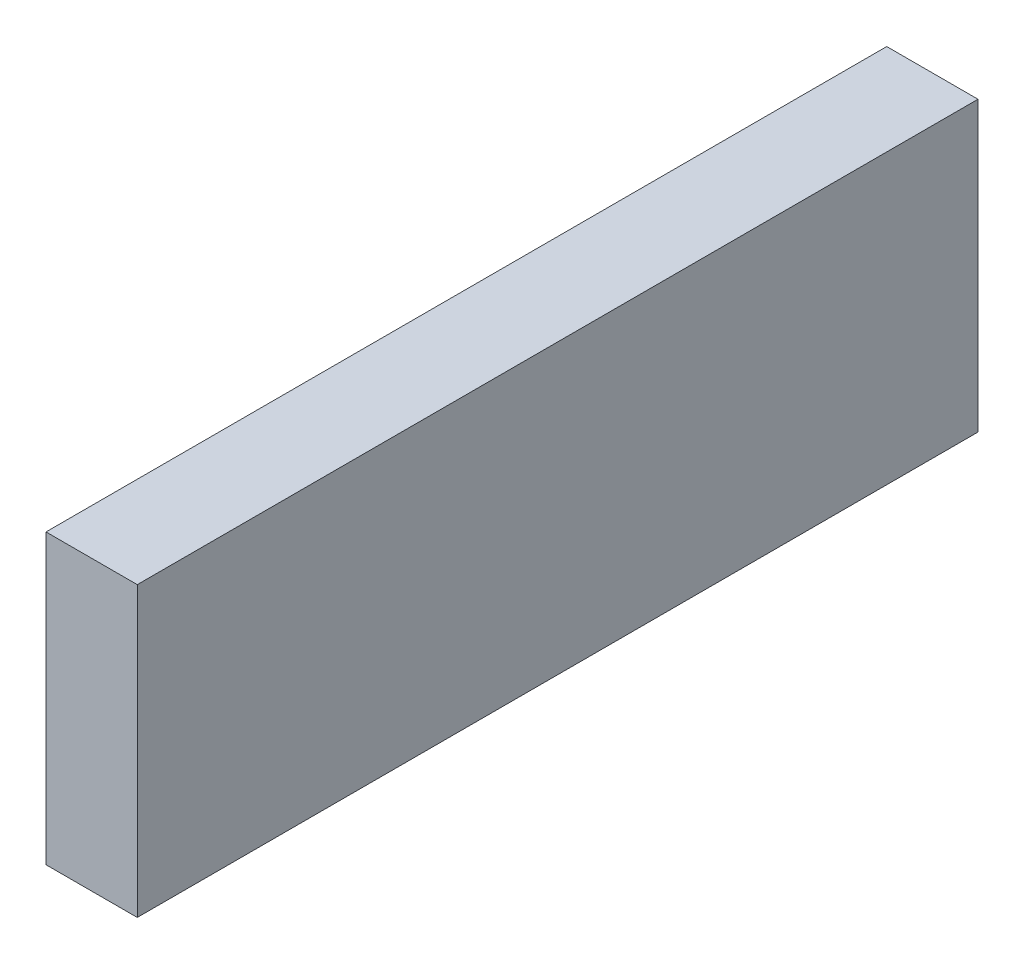
ISO-10303-21;
HEADER;
FILE_DESCRIPTION(('STEP AP214'),'2;1');
FILE_NAME('part.step','',(''),(''),'','','');
FILE_SCHEMA(('AUTOMOTIVE_DESIGN { 1 0 10303 214 1 1 1 1 }'));
ENDSEC;
DATA;
#1=APPLICATION_CONTEXT('core data for automotive mechanical design processes');
#2=APPLICATION_PROTOCOL_DEFINITION('international standard','automotive_design',2000,#1);
#3=PRODUCT_CONTEXT('',#1,'mechanical');
#4=PRODUCT('Part','Part','',(#3));
#5=PRODUCT_RELATED_PRODUCT_CATEGORY('part','',(#4));
#6=PRODUCT_DEFINITION_FORMATION('','',#4);
#7=PRODUCT_DEFINITION_CONTEXT('part definition',#1,'design');
#8=PRODUCT_DEFINITION('design','',#6,#7);
#9=PRODUCT_DEFINITION_SHAPE('','',#8);
#10=(LENGTH_UNIT() NAMED_UNIT(*) SI_UNIT(.MILLI.,.METRE.));
#11=(NAMED_UNIT(*) PLANE_ANGLE_UNIT() SI_UNIT($,.RADIAN.));
#12=(NAMED_UNIT(*) SI_UNIT($,.STERADIAN.) SOLID_ANGLE_UNIT());
#13=UNCERTAINTY_MEASURE_WITH_UNIT(LENGTH_MEASURE(1.E-05),#10,'distance_accuracy_value','');
#14=(GEOMETRIC_REPRESENTATION_CONTEXT(3) GLOBAL_UNCERTAINTY_ASSIGNED_CONTEXT((#13)) GLOBAL_UNIT_ASSIGNED_CONTEXT((#10,
#11,#12)) REPRESENTATION_CONTEXT('',''));
#15=CARTESIAN_POINT('',(0.,0.,0.));
#16=DIRECTION('',(0.,0.,1.));
#17=DIRECTION('',(1.,0.,0.));
#18=AXIS2_PLACEMENT_3D('',#15,#16,#17);
#19=CARTESIAN_POINT('',(19.,-30.,87.5));
#20=DIRECTION('',(0.,0.,-1.));
#21=DIRECTION('',(-1.,0.,0.));
#22=AXIS2_PLACEMENT_3D('',#19,#20,#21);
#23=PLANE('',#22);
#24=DIRECTION('',(0.,-1.,0.));
#25=VECTOR('',#24,1.);
#26=CARTESIAN_POINT('',(0.,-30.,87.5));
#27=LINE('',#26,#25);
#28=CARTESIAN_POINT('',(0.,30.,87.5));
#29=VERTEX_POINT('',#28);
#30=CARTESIAN_POINT('',(0.,-30.,87.5));
#31=VERTEX_POINT('',#30);
#32=EDGE_CURVE('E96',#29,#31,#27,.T.);
#33=ORIENTED_EDGE('',*,*,#32,.T.);
#34=DIRECTION('',(-1.,0.,0.));
#35=VECTOR('',#34,1.);
#36=CARTESIAN_POINT('',(19.,-30.,87.5));
#37=LINE('',#36,#35);
#38=CARTESIAN_POINT('',(19.,-30.,87.5));
#39=VERTEX_POINT('',#38);
#40=EDGE_CURVE('E11',#39,#31,#37,.T.);
#41=ORIENTED_EDGE('',*,*,#40,.F.);
#42=DIRECTION('',(0.,-1.,0.));
#43=VECTOR('',#42,1.);
#44=CARTESIAN_POINT('',(19.,-30.,87.5));
#45=LINE('',#44,#43);
#46=CARTESIAN_POINT('',(19.,30.,87.5));
#47=VERTEX_POINT('',#46);
#48=EDGE_CURVE('E84',#47,#39,#45,.T.);
#49=ORIENTED_EDGE('',*,*,#48,.F.);
#50=DIRECTION('',(-1.,0.,0.));
#51=VECTOR('',#50,1.);
#52=CARTESIAN_POINT('',(19.,30.,87.5));
#53=LINE('',#52,#51);
#54=EDGE_CURVE('E92',#47,#29,#53,.T.);
#55=ORIENTED_EDGE('',*,*,#54,.T.);
#56=EDGE_LOOP('',(#33,#41,#49,#55));
#57=FACE_BOUND('',#56,.T.);
#58=ADVANCED_FACE('F33',(#57),#23,.F.);
#59=CARTESIAN_POINT('',(19.,-30.,87.5));
#60=DIRECTION('',(0.,1.,0.));
#61=DIRECTION('',(0.,0.,1.));
#62=AXIS2_PLACEMENT_3D('',#59,#60,#61);
#63=PLANE('',#62);
#64=DIRECTION('',(0.,0.,-1.));
#65=VECTOR('',#64,1.);
#66=CARTESIAN_POINT('',(0.,-30.,87.5));
#67=LINE('',#66,#65);
#68=CARTESIAN_POINT('',(0.,-30.,-87.5));
#69=VERTEX_POINT('',#68);
#70=EDGE_CURVE('E88',#31,#69,#67,.T.);
#71=ORIENTED_EDGE('',*,*,#70,.T.);
#72=DIRECTION('',(-1.,0.,0.));
#73=VECTOR('',#72,1.);
#74=CARTESIAN_POINT('',(19.,-30.,-87.5));
#75=LINE('',#74,#73);
#76=CARTESIAN_POINT('',(19.,-30.,-87.5));
#77=VERTEX_POINT('',#76);
#78=EDGE_CURVE('E41',#77,#69,#75,.T.);
#79=ORIENTED_EDGE('',*,*,#78,.F.);
#80=DIRECTION('',(0.,0.,-1.));
#81=VECTOR('',#80,1.);
#82=CARTESIAN_POINT('',(19.,-30.,87.5));
#83=LINE('',#82,#81);
#84=EDGE_CURVE('E79',#39,#77,#83,.T.);
#85=ORIENTED_EDGE('',*,*,#84,.F.);
#86=ORIENTED_EDGE('',*,*,#40,.T.);
#87=EDGE_LOOP('',(#71,#79,#85,#86));
#88=FACE_BOUND('',#87,.T.);
#89=ADVANCED_FACE('F87',(#88),#63,.F.);
#90=CARTESIAN_POINT('',(19.,-30.,-87.5));
#91=DIRECTION('',(0.,0.,1.));
#92=DIRECTION('',(1.,0.,0.));
#93=AXIS2_PLACEMENT_3D('',#90,#91,#92);
#94=PLANE('',#93);
#95=DIRECTION('',(0.,1.,0.));
#96=VECTOR('',#95,1.);
#97=CARTESIAN_POINT('',(0.,-30.,-87.5));
#98=LINE('',#97,#96);
#99=CARTESIAN_POINT('',(0.,30.,-87.5));
#100=VERTEX_POINT('',#99);
#101=EDGE_CURVE('E66',#69,#100,#98,.T.);
#102=ORIENTED_EDGE('',*,*,#101,.T.);
#103=DIRECTION('',(-1.,0.,0.));
#104=VECTOR('',#103,1.);
#105=CARTESIAN_POINT('',(19.,30.,-87.5));
#106=LINE('',#105,#104);
#107=CARTESIAN_POINT('',(19.,30.,-87.5));
#108=VERTEX_POINT('',#107);
#109=EDGE_CURVE('E89',#108,#100,#106,.T.);
#110=ORIENTED_EDGE('',*,*,#109,.F.);
#111=DIRECTION('',(0.,1.,0.));
#112=VECTOR('',#111,1.);
#113=CARTESIAN_POINT('',(19.,-30.,-87.5));
#114=LINE('',#113,#112);
#115=EDGE_CURVE('E82',#77,#108,#114,.T.);
#116=ORIENTED_EDGE('',*,*,#115,.F.);
#117=ORIENTED_EDGE('',*,*,#78,.T.);
#118=EDGE_LOOP('',(#102,#110,#116,#117));
#119=FACE_BOUND('',#118,.T.);
#120=ADVANCED_FACE('F90',(#119),#94,.F.);
#121=CARTESIAN_POINT('',(19.,30.,87.5));
#122=DIRECTION('',(0.,-1.,0.));
#123=DIRECTION('',(0.,0.,-1.));
#124=AXIS2_PLACEMENT_3D('',#121,#122,#123);
#125=PLANE('',#124);
#126=DIRECTION('',(0.,0.,1.));
#127=VECTOR('',#126,1.);
#128=CARTESIAN_POINT('',(0.,30.,87.5));
#129=LINE('',#128,#127);
#130=EDGE_CURVE('E72',#100,#29,#129,.T.);
#131=ORIENTED_EDGE('',*,*,#130,.T.);
#132=ORIENTED_EDGE('',*,*,#54,.F.);
#133=DIRECTION('',(0.,0.,1.));
#134=VECTOR('',#133,1.);
#135=CARTESIAN_POINT('',(19.,30.,87.5));
#136=LINE('',#135,#134);
#137=EDGE_CURVE('E49',#108,#47,#136,.T.);
#138=ORIENTED_EDGE('',*,*,#137,.F.);
#139=ORIENTED_EDGE('',*,*,#109,.T.);
#140=EDGE_LOOP('',(#131,#132,#138,#139));
#141=FACE_BOUND('',#140,.T.);
#142=ADVANCED_FACE('F103',(#141),#125,.F.);
#143=CARTESIAN_POINT('',(19.,0.,0.));
#144=DIRECTION('',(-1.,0.,0.));
#145=DIRECTION('',(0.,0.,1.));
#146=AXIS2_PLACEMENT_3D('',#143,#144,#145);
#147=PLANE('',#146);
#148=ORIENTED_EDGE('',*,*,#48,.T.);
#149=ORIENTED_EDGE('',*,*,#84,.T.);
#150=ORIENTED_EDGE('',*,*,#115,.T.);
#151=ORIENTED_EDGE('',*,*,#137,.T.);
#152=EDGE_LOOP('',(#148,#149,#150,#151));
#153=FACE_BOUND('',#152,.T.);
#154=ADVANCED_FACE('F80',(#153),#147,.F.);
#155=CARTESIAN_POINT('',(0.,0.,0.));
#156=DIRECTION('',(-1.,0.,0.));
#157=DIRECTION('',(0.,0.,1.));
#158=AXIS2_PLACEMENT_3D('',#155,#156,#157);
#159=PLANE('',#158);
#160=ORIENTED_EDGE('',*,*,#32,.F.);
#161=ORIENTED_EDGE('',*,*,#130,.F.);
#162=ORIENTED_EDGE('',*,*,#101,.F.);
#163=ORIENTED_EDGE('',*,*,#70,.F.);
#164=EDGE_LOOP('',(#160,#161,#162,#163));
#165=FACE_BOUND('',#164,.T.);
#166=ADVANCED_FACE('F106',(#165),#159,.T.);
#167=CLOSED_SHELL('',(#58,#89,#120,#142,#154,#166));
#168=MANIFOLD_SOLID_BREP('B2',#167);
#169=ADVANCED_BREP_SHAPE_REPRESENTATION('',(#18,#168),#14);
#170=SHAPE_DEFINITION_REPRESENTATION(#9,#169);
ENDSEC;
END-ISO-10303-21;
